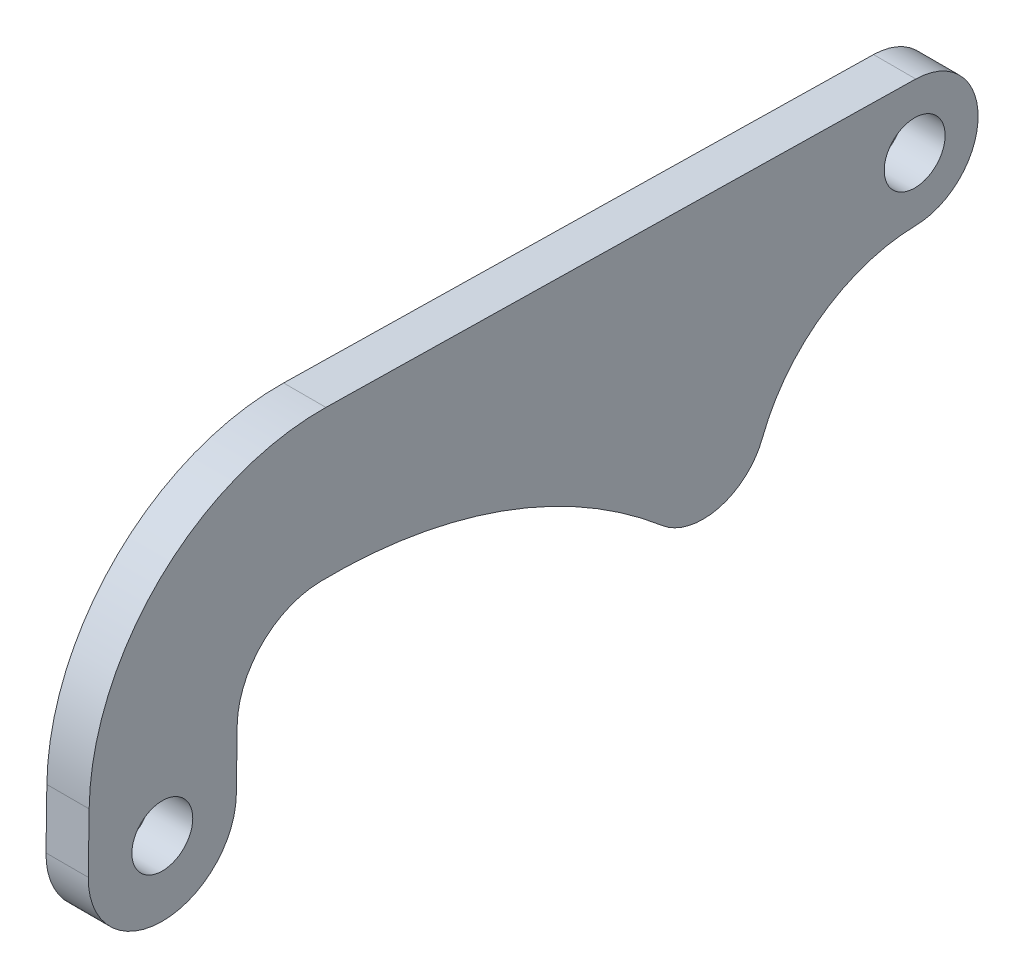
ISO-10303-21;
HEADER;
FILE_DESCRIPTION(('STEP AP214'),'2;1');
FILE_NAME('part.step','',(''),(''),'','','');
FILE_SCHEMA(('AUTOMOTIVE_DESIGN { 1 0 10303 214 1 1 1 1 }'));
ENDSEC;
DATA;
#1=APPLICATION_CONTEXT('core data for automotive mechanical design processes');
#2=APPLICATION_PROTOCOL_DEFINITION('international standard','automotive_design',2000,#1);
#3=PRODUCT_CONTEXT('',#1,'mechanical');
#4=PRODUCT('Part','Part','',(#3));
#5=PRODUCT_RELATED_PRODUCT_CATEGORY('part','',(#4));
#6=PRODUCT_DEFINITION_FORMATION('','',#4);
#7=PRODUCT_DEFINITION_CONTEXT('part definition',#1,'design');
#8=PRODUCT_DEFINITION('design','',#6,#7);
#9=PRODUCT_DEFINITION_SHAPE('','',#8);
#10=(LENGTH_UNIT() NAMED_UNIT(*) SI_UNIT(.MILLI.,.METRE.));
#11=(NAMED_UNIT(*) PLANE_ANGLE_UNIT() SI_UNIT($,.RADIAN.));
#12=(NAMED_UNIT(*) SI_UNIT($,.STERADIAN.) SOLID_ANGLE_UNIT());
#13=UNCERTAINTY_MEASURE_WITH_UNIT(LENGTH_MEASURE(1.E-05),#10,'distance_accuracy_value','');
#14=(GEOMETRIC_REPRESENTATION_CONTEXT(3) GLOBAL_UNCERTAINTY_ASSIGNED_CONTEXT((#13)) GLOBAL_UNIT_ASSIGNED_CONTEXT((#10,
#11,#12)) REPRESENTATION_CONTEXT('',''));
#15=CARTESIAN_POINT('',(0.,0.,0.));
#16=DIRECTION('',(0.,0.,1.));
#17=DIRECTION('',(1.,0.,0.));
#18=AXIS2_PLACEMENT_3D('',#15,#16,#17);
#19=CARTESIAN_POINT('',(1.5875,16.1580786363282,-56.4713237053307));
#20=DIRECTION('',(1.,0.,0.));
#21=DIRECTION('',(0.,0.,-1.));
#22=AXIS2_PLACEMENT_3D('',#19,#20,#21);
#23=PLANE('',#22);
#24=CARTESIAN_POINT('',(1.5875,0.,0.));
#25=DIRECTION('',(1.,0.,0.));
#26=DIRECTION('',(0.,0.,-1.));
#27=AXIS2_PLACEMENT_3D('',#24,#25,#26);
#28=CIRCLE('',#27,2.286);
#29=CARTESIAN_POINT('',(1.5875,0.,-2.286));
#30=VERTEX_POINT('',#29);
#31=EDGE_CURVE('E186',#30,#30,#28,.T.);
#32=ORIENTED_EDGE('',*,*,#31,.F.);
#33=EDGE_LOOP('',(#32));
#34=FACE_BOUND('',#33,.T.);
#35=CARTESIAN_POINT('',(1.5875,16.1580786363282,-56.4713237053307));
#36=DIRECTION('',(1.,0.,0.));
#37=DIRECTION('',(0.,0.,-1.));
#38=AXIS2_PLACEMENT_3D('',#35,#36,#37);
#39=CIRCLE('',#38,4.76249999999997);
#40=CARTESIAN_POINT('',(1.5875,11.3963361981293,-56.5562660519865));
#41=VERTEX_POINT('',#40);
#42=CARTESIAN_POINT('',(1.5875,20.9198210745271,-56.5562660519865));
#43=VERTEX_POINT('',#42);
#44=EDGE_CURVE('E209',#41,#43,#39,.T.);
#45=ORIENTED_EDGE('',*,*,#44,.T.);
#46=DIRECTION('',(0.,0.0178356633397855,0.999840931905286));
#47=VECTOR('',#46,1.);
#48=CARTESIAN_POINT('',(1.5875,20.9198210745271,-56.5562660519865));
#49=LINE('',#48,#47);
#50=CARTESIAN_POINT('',(1.5875,21.7096567039138,-12.2792477716243));
#51=VERTEX_POINT('',#50);
#52=EDGE_CURVE('E126',#43,#51,#49,.T.);
#53=ORIENTED_EDGE('',*,*,#52,.T.);
#54=CARTESIAN_POINT('',(1.5875,4.24993443051777,-11.9677925005533));
#55=DIRECTION('',(1.,0.,0.));
#56=DIRECTION('',(0.,0.,1.));
#57=AXIS2_PLACEMENT_3D('',#54,#55,#56);
#58=CIRCLE('',#57,17.4625);
#59=CARTESIAN_POINT('',(1.5875,4.49784969156588,5.49294758322719));
#60=VERTEX_POINT('',#59);
#61=EDGE_CURVE('E237',#51,#60,#58,.T.);
#62=ORIENTED_EDGE('',*,*,#61,.T.);
#63=DIRECTION('',(0.,-0.999899217396164,0.0141970085066924));
#64=VECTOR('',#63,1.);
#65=CARTESIAN_POINT('',(1.5875,0.078882128515306,5.55569002665744));
#66=LINE('',#65,#64);
#67=CARTESIAN_POINT('',(1.5875,0.078882128515306,5.55569002665744));
#68=VERTEX_POINT('',#67);
#69=EDGE_CURVE('E257',#60,#68,#66,.T.);
#70=ORIENTED_EDGE('',*,*,#69,.T.);
#71=CARTESIAN_POINT('',(1.5875,0.,0.));
#72=DIRECTION('',(1.,0.,0.));
#73=DIRECTION('',(0.,0.,-1.));
#74=AXIS2_PLACEMENT_3D('',#71,#72,#73);
#75=CIRCLE('',#74,5.55625);
#76=CARTESIAN_POINT('',(1.5875,-0.0788821285153071,-5.55569002665744));
#77=VERTEX_POINT('',#76);
#78=EDGE_CURVE('E253',#68,#77,#75,.T.);
#79=ORIENTED_EDGE('',*,*,#78,.T.);
#80=DIRECTION('',(0.,0.999899217396164,-0.0141970085066914));
#81=VECTOR('',#80,1.);
#82=CARTESIAN_POINT('',(1.5875,-0.0788821285153061,-5.55569002665744));
#83=LINE('',#82,#81);
#84=CARTESIAN_POINT('',(1.5875,4.34008543453526,-5.61843247008768));
#85=VERTEX_POINT('',#84);
#86=EDGE_CURVE('E256',#77,#85,#83,.T.);
#87=ORIENTED_EDGE('',*,*,#86,.T.);
#88=CARTESIAN_POINT('',(1.5875,4.24993443051777,-11.9677925005533));
#89=DIRECTION('',(-1.,0.,0.));
#90=DIRECTION('',(0.,0.,-1.));
#91=AXIS2_PLACEMENT_3D('',#88,#89,#90);
#92=CIRCLE('',#91,6.35);
#93=CARTESIAN_POINT('',(1.5875,10.5989243481163,-11.8545360383457));
#94=VERTEX_POINT('',#93);
#95=EDGE_CURVE('E157',#85,#94,#92,.T.);
#96=ORIENTED_EDGE('',*,*,#95,.T.);
#97=CARTESIAN_POINT('',(1.5875,-27.9191487336336,-12.5416407187613));
#98=DIRECTION('',(-1.,0.,0.));
#99=DIRECTION('',(0.,0.,1.));
#100=AXIS2_PLACEMENT_3D('',#97,#98,#99);
#101=CIRCLE('',#100,38.5242010530118);
#102=CARTESIAN_POINT('',(1.5875,1.41872534697317,-37.5096845188539));
#103=VERTEX_POINT('',#102);
#104=EDGE_CURVE('E151',#94,#103,#101,.T.);
#105=ORIENTED_EDGE('',*,*,#104,.T.);
#106=CARTESIAN_POINT('',(1.5875,5.04557863632817,-40.5963237053308));
#107=DIRECTION('',(1.,0.,0.));
#108=DIRECTION('',(0.,0.,-1.));
#109=AXIS2_PLACEMENT_3D('',#106,#107,#108);
#110=CIRCLE('',#109,4.7625);
#111=CARTESIAN_POINT('',(1.5875,3.33590888545608,-45.0413698910248));
#112=VERTEX_POINT('',#111);
#113=EDGE_CURVE('E155',#103,#112,#110,.T.);
#114=ORIENTED_EDGE('',*,*,#113,.T.);
#115=CARTESIAN_POINT('',(1.5875,-1.17927478392445,-56.7805960995076));
#116=DIRECTION('',(-1.,0.,0.));
#117=DIRECTION('',(0.,0.,1.));
#118=AXIS2_PLACEMENT_3D('',#115,#116,#117);
#119=CIRCLE('',#118,12.5776116787795);
#120=EDGE_CURVE('E66',#112,#41,#119,.T.);
#121=ORIENTED_EDGE('',*,*,#120,.T.);
#122=EDGE_LOOP('',(#45,#53,#62,#70,#79,#87,#96,#105,#114,#121));
#123=FACE_BOUND('',#122,.T.);
#124=CARTESIAN_POINT('',(1.5875,16.1580786363282,-56.4713237053307));
#125=DIRECTION('',(1.,0.,0.));
#126=DIRECTION('',(0.,0.,-1.));
#127=AXIS2_PLACEMENT_3D('',#124,#125,#126);
#128=CIRCLE('',#127,2.28599999999999);
#129=CARTESIAN_POINT('',(1.5875,16.1580786363282,-58.7573237053307));
#130=VERTEX_POINT('',#129);
#131=EDGE_CURVE('E275',#130,#130,#128,.T.);
#132=ORIENTED_EDGE('',*,*,#131,.F.);
#133=EDGE_LOOP('',(#132));
#134=FACE_BOUND('',#133,.T.);
#135=ADVANCED_FACE('F45',(#34,#123,#134),#23,.T.);
#136=CARTESIAN_POINT('',(-1.5875,16.1580786363282,-56.4713237053307));
#137=DIRECTION('',(1.,0.,0.));
#138=DIRECTION('',(0.,0.,-1.));
#139=AXIS2_PLACEMENT_3D('',#136,#137,#138);
#140=PLANE('',#139);
#141=CARTESIAN_POINT('',(-1.5875,16.1580786363282,-56.4713237053307));
#142=DIRECTION('',(1.,0.,0.));
#143=DIRECTION('',(0.,0.,-1.));
#144=AXIS2_PLACEMENT_3D('',#141,#142,#143);
#145=CIRCLE('',#144,4.76249999999997);
#146=CARTESIAN_POINT('',(-1.5875,11.3963361981293,-56.5562660519865));
#147=VERTEX_POINT('',#146);
#148=CARTESIAN_POINT('',(-1.5875,20.9198210745271,-56.5562660519865));
#149=VERTEX_POINT('',#148);
#150=EDGE_CURVE('E181',#147,#149,#145,.T.);
#151=ORIENTED_EDGE('',*,*,#150,.F.);
#152=CARTESIAN_POINT('',(-1.5875,-1.17927478392445,-56.7805960995076));
#153=DIRECTION('',(-1.,0.,0.));
#154=DIRECTION('',(0.,0.,1.));
#155=AXIS2_PLACEMENT_3D('',#152,#153,#154);
#156=CIRCLE('',#155,12.5776116787795);
#157=CARTESIAN_POINT('',(-1.5875,3.33590888545608,-45.0413698910248));
#158=VERTEX_POINT('',#157);
#159=EDGE_CURVE('E116',#158,#147,#156,.T.);
#160=ORIENTED_EDGE('',*,*,#159,.F.);
#161=CARTESIAN_POINT('',(-1.5875,5.04557863632817,-40.5963237053308));
#162=DIRECTION('',(1.,0.,0.));
#163=DIRECTION('',(0.,0.,-1.));
#164=AXIS2_PLACEMENT_3D('',#161,#162,#163);
#165=CIRCLE('',#164,4.7625);
#166=CARTESIAN_POINT('',(-1.5875,1.41872534697317,-37.5096845188539));
#167=VERTEX_POINT('',#166);
#168=EDGE_CURVE('E110',#167,#158,#165,.T.);
#169=ORIENTED_EDGE('',*,*,#168,.F.);
#170=CARTESIAN_POINT('',(-1.5875,-27.9191487336336,-12.5416407187613));
#171=DIRECTION('',(-1.,0.,0.));
#172=DIRECTION('',(0.,0.,1.));
#173=AXIS2_PLACEMENT_3D('',#170,#171,#172);
#174=CIRCLE('',#173,38.5242010530118);
#175=CARTESIAN_POINT('',(-1.5875,10.5989243481163,-11.8545360383457));
#176=VERTEX_POINT('',#175);
#177=EDGE_CURVE('E166',#176,#167,#174,.T.);
#178=ORIENTED_EDGE('',*,*,#177,.F.);
#179=CARTESIAN_POINT('',(-1.5875,4.24993443051777,-11.9677925005533));
#180=DIRECTION('',(-1.,0.,0.));
#181=DIRECTION('',(0.,0.,-1.));
#182=AXIS2_PLACEMENT_3D('',#179,#180,#181);
#183=CIRCLE('',#182,6.35);
#184=CARTESIAN_POINT('',(-1.5875,4.34008543453526,-5.61843247008768));
#185=VERTEX_POINT('',#184);
#186=EDGE_CURVE('E201',#185,#176,#183,.T.);
#187=ORIENTED_EDGE('',*,*,#186,.F.);
#188=DIRECTION('',(0.,0.999899217396164,-0.0141970085066914));
#189=VECTOR('',#188,1.);
#190=CARTESIAN_POINT('',(-1.5875,-0.0788821285153061,-5.55569002665744));
#191=LINE('',#190,#189);
#192=CARTESIAN_POINT('',(-1.5875,-0.0788821285153071,-5.55569002665744));
#193=VERTEX_POINT('',#192);
#194=EDGE_CURVE('E198',#193,#185,#191,.T.);
#195=ORIENTED_EDGE('',*,*,#194,.F.);
#196=CARTESIAN_POINT('',(-1.5875,0.,0.));
#197=DIRECTION('',(1.,0.,0.));
#198=DIRECTION('',(0.,0.,-1.));
#199=AXIS2_PLACEMENT_3D('',#196,#197,#198);
#200=CIRCLE('',#199,5.55625);
#201=CARTESIAN_POINT('',(-1.5875,0.078882128515306,5.55569002665744));
#202=VERTEX_POINT('',#201);
#203=EDGE_CURVE('E195',#202,#193,#200,.T.);
#204=ORIENTED_EDGE('',*,*,#203,.F.);
#205=DIRECTION('',(0.,-0.999899217396164,0.0141970085066924));
#206=VECTOR('',#205,1.);
#207=CARTESIAN_POINT('',(-1.5875,0.078882128515306,5.55569002665744));
#208=LINE('',#207,#206);
#209=CARTESIAN_POINT('',(-1.5875,4.49784969156588,5.49294758322719));
#210=VERTEX_POINT('',#209);
#211=EDGE_CURVE('E192',#210,#202,#208,.T.);
#212=ORIENTED_EDGE('',*,*,#211,.F.);
#213=CARTESIAN_POINT('',(-1.5875,4.24993443051777,-11.9677925005533));
#214=DIRECTION('',(1.,0.,0.));
#215=DIRECTION('',(0.,0.,1.));
#216=AXIS2_PLACEMENT_3D('',#213,#214,#215);
#217=CIRCLE('',#216,17.4625);
#218=CARTESIAN_POINT('',(-1.5875,21.7096567039138,-12.2792477716243));
#219=VERTEX_POINT('',#218);
#220=EDGE_CURVE('E189',#219,#210,#217,.T.);
#221=ORIENTED_EDGE('',*,*,#220,.F.);
#222=DIRECTION('',(0.,0.0178356633397855,0.999840931905286));
#223=VECTOR('',#222,1.);
#224=CARTESIAN_POINT('',(-1.5875,20.9198210745271,-56.5562660519865));
#225=LINE('',#224,#223);
#226=EDGE_CURVE('E185',#149,#219,#225,.T.);
#227=ORIENTED_EDGE('',*,*,#226,.F.);
#228=EDGE_LOOP('',(#151,#160,#169,#178,#187,#195,#204,#212,#221,#227));
#229=FACE_BOUND('',#228,.T.);
#230=CARTESIAN_POINT('',(-1.5875,0.,0.));
#231=DIRECTION('',(1.,0.,0.));
#232=DIRECTION('',(0.,0.,-1.));
#233=AXIS2_PLACEMENT_3D('',#230,#231,#232);
#234=CIRCLE('',#233,2.286);
#235=CARTESIAN_POINT('',(-1.5875,0.,-2.286));
#236=VERTEX_POINT('',#235);
#237=EDGE_CURVE('E272',#236,#236,#234,.T.);
#238=ORIENTED_EDGE('',*,*,#237,.T.);
#239=EDGE_LOOP('',(#238));
#240=FACE_BOUND('',#239,.T.);
#241=CARTESIAN_POINT('',(-1.5875,16.1580786363282,-56.4713237053307));
#242=DIRECTION('',(1.,0.,0.));
#243=DIRECTION('',(0.,0.,-1.));
#244=AXIS2_PLACEMENT_3D('',#241,#242,#243);
#245=CIRCLE('',#244,2.28599999999999);
#246=CARTESIAN_POINT('',(-1.5875,16.1580786363282,-58.7573237053307));
#247=VERTEX_POINT('',#246);
#248=EDGE_CURVE('E279',#247,#247,#245,.T.);
#249=ORIENTED_EDGE('',*,*,#248,.T.);
#250=EDGE_LOOP('',(#249));
#251=FACE_BOUND('',#250,.T.);
#252=ADVANCED_FACE('F241',(#229,#240,#251),#140,.F.);
#253=CARTESIAN_POINT('',(1.5875,16.1580786363282,-56.4713237053307));
#254=DIRECTION('',(-1.,0.,0.));
#255=DIRECTION('',(0.,0.,1.));
#256=AXIS2_PLACEMENT_3D('',#253,#254,#255);
#257=CYLINDRICAL_SURFACE('',#256,4.76249999999997);
#258=ORIENTED_EDGE('',*,*,#150,.T.);
#259=DIRECTION('',(-1.,0.,0.));
#260=VECTOR('',#259,1.);
#261=CARTESIAN_POINT('',(1.5875,20.9198210745271,-56.5562660519865));
#262=LINE('',#261,#260);
#263=EDGE_CURVE('E11',#43,#149,#262,.T.);
#264=ORIENTED_EDGE('',*,*,#263,.F.);
#265=ORIENTED_EDGE('',*,*,#44,.F.);
#266=DIRECTION('',(-1.,0.,0.));
#267=VECTOR('',#266,1.);
#268=CARTESIAN_POINT('',(1.5875,11.3963361981293,-56.5562660519865));
#269=LINE('',#268,#267);
#270=EDGE_CURVE('E177',#41,#147,#269,.T.);
#271=ORIENTED_EDGE('',*,*,#270,.T.);
#272=EDGE_LOOP('',(#258,#264,#265,#271));
#273=FACE_BOUND('',#272,.T.);
#274=ADVANCED_FACE('F47',(#273),#257,.T.);
#275=CARTESIAN_POINT('',(1.5875,20.9198210745271,-56.5562660519865));
#276=DIRECTION('',(0.,-0.999840931905285,0.0178356633397855));
#277=DIRECTION('',(0.,-0.0178356633397855,-0.999840931905286));
#278=AXIS2_PLACEMENT_3D('',#275,#276,#277);
#279=PLANE('',#278);
#280=ORIENTED_EDGE('',*,*,#226,.T.);
#281=DIRECTION('',(-1.,0.,0.));
#282=VECTOR('',#281,1.);
#283=CARTESIAN_POINT('',(1.5875,21.7096567039138,-12.2792477716243));
#284=LINE('',#283,#282);
#285=EDGE_CURVE('E55',#51,#219,#284,.T.);
#286=ORIENTED_EDGE('',*,*,#285,.F.);
#287=ORIENTED_EDGE('',*,*,#52,.F.);
#288=ORIENTED_EDGE('',*,*,#263,.T.);
#289=EDGE_LOOP('',(#280,#286,#287,#288));
#290=FACE_BOUND('',#289,.T.);
#291=ADVANCED_FACE('F320',(#290),#279,.F.);
#292=CARTESIAN_POINT('',(1.5875,4.24993443051777,-11.9677925005533));
#293=DIRECTION('',(-1.,0.,0.));
#294=DIRECTION('',(0.,0.,1.));
#295=AXIS2_PLACEMENT_3D('',#292,#293,#294);
#296=CYLINDRICAL_SURFACE('',#295,17.4625);
#297=ORIENTED_EDGE('',*,*,#220,.T.);
#298=DIRECTION('',(-1.,0.,0.));
#299=VECTOR('',#298,1.);
#300=CARTESIAN_POINT('',(1.5875,4.49784969156588,5.49294758322719));
#301=LINE('',#300,#299);
#302=EDGE_CURVE('E227',#60,#210,#301,.T.);
#303=ORIENTED_EDGE('',*,*,#302,.F.);
#304=ORIENTED_EDGE('',*,*,#61,.F.);
#305=ORIENTED_EDGE('',*,*,#285,.T.);
#306=EDGE_LOOP('',(#297,#303,#304,#305));
#307=FACE_BOUND('',#306,.T.);
#308=ADVANCED_FACE('F235',(#307),#296,.T.);
#309=CARTESIAN_POINT('',(1.5875,0.078882128515306,5.55569002665744));
#310=DIRECTION('',(0.,-0.0141970085066924,-0.999899217396164));
#311=DIRECTION('',(0.,0.999899217396164,-0.0141970085066924));
#312=AXIS2_PLACEMENT_3D('',#309,#310,#311);
#313=PLANE('',#312);
#314=ORIENTED_EDGE('',*,*,#211,.T.);
#315=DIRECTION('',(-1.,0.,0.));
#316=VECTOR('',#315,1.);
#317=CARTESIAN_POINT('',(1.5875,0.078882128515306,5.55569002665744));
#318=LINE('',#317,#316);
#319=EDGE_CURVE('E223',#68,#202,#318,.T.);
#320=ORIENTED_EDGE('',*,*,#319,.F.);
#321=ORIENTED_EDGE('',*,*,#69,.F.);
#322=ORIENTED_EDGE('',*,*,#302,.T.);
#323=EDGE_LOOP('',(#314,#320,#321,#322));
#324=FACE_BOUND('',#323,.T.);
#325=ADVANCED_FACE('F247',(#324),#313,.F.);
#326=CARTESIAN_POINT('',(1.5875,0.,0.));
#327=DIRECTION('',(-1.,0.,0.));
#328=DIRECTION('',(0.,0.,1.));
#329=AXIS2_PLACEMENT_3D('',#326,#327,#328);
#330=CYLINDRICAL_SURFACE('',#329,5.55625);
#331=ORIENTED_EDGE('',*,*,#203,.T.);
#332=DIRECTION('',(-1.,0.,0.));
#333=VECTOR('',#332,1.);
#334=CARTESIAN_POINT('',(1.5875,-0.0788821285153071,-5.55569002665744));
#335=LINE('',#334,#333);
#336=EDGE_CURVE('E219',#77,#193,#335,.T.);
#337=ORIENTED_EDGE('',*,*,#336,.F.);
#338=ORIENTED_EDGE('',*,*,#78,.F.);
#339=ORIENTED_EDGE('',*,*,#319,.T.);
#340=EDGE_LOOP('',(#331,#337,#338,#339));
#341=FACE_BOUND('',#340,.T.);
#342=ADVANCED_FACE('F251',(#341),#330,.T.);
#343=CARTESIAN_POINT('',(1.5875,-0.0788821285153061,-5.55569002665744));
#344=DIRECTION('',(0.,0.0141970085066914,0.999899217396164));
#345=DIRECTION('',(0.,-0.999899217396164,0.0141970085066914));
#346=AXIS2_PLACEMENT_3D('',#343,#344,#345);
#347=PLANE('',#346);
#348=ORIENTED_EDGE('',*,*,#194,.T.);
#349=DIRECTION('',(-1.,0.,0.));
#350=VECTOR('',#349,1.);
#351=CARTESIAN_POINT('',(1.5875,4.34008543453526,-5.61843247008768));
#352=LINE('',#351,#350);
#353=EDGE_CURVE('E215',#85,#185,#352,.T.);
#354=ORIENTED_EDGE('',*,*,#353,.F.);
#355=ORIENTED_EDGE('',*,*,#86,.F.);
#356=ORIENTED_EDGE('',*,*,#336,.T.);
#357=EDGE_LOOP('',(#348,#354,#355,#356));
#358=FACE_BOUND('',#357,.T.);
#359=ADVANCED_FACE('F310',(#358),#347,.F.);
#360=CARTESIAN_POINT('',(1.5875,4.24993443051777,-11.9677925005533));
#361=DIRECTION('',(-1.,0.,0.));
#362=DIRECTION('',(0.,0.,1.));
#363=AXIS2_PLACEMENT_3D('',#360,#361,#362);
#364=CYLINDRICAL_SURFACE('',#363,6.35);
#365=ORIENTED_EDGE('',*,*,#186,.T.);
#366=DIRECTION('',(-1.,0.,0.));
#367=VECTOR('',#366,1.);
#368=CARTESIAN_POINT('',(1.5875,10.5989243481163,-11.8545360383457));
#369=LINE('',#368,#367);
#370=EDGE_CURVE('E168',#94,#176,#369,.T.);
#371=ORIENTED_EDGE('',*,*,#370,.F.);
#372=ORIENTED_EDGE('',*,*,#95,.F.);
#373=ORIENTED_EDGE('',*,*,#353,.T.);
#374=EDGE_LOOP('',(#365,#371,#372,#373));
#375=FACE_BOUND('',#374,.T.);
#376=ADVANCED_FACE('F307',(#375),#364,.F.);
#377=CARTESIAN_POINT('',(1.5875,-27.9191487336336,-12.5416407187613));
#378=DIRECTION('',(-1.,0.,0.));
#379=DIRECTION('',(0.,0.,1.));
#380=AXIS2_PLACEMENT_3D('',#377,#378,#379);
#381=CYLINDRICAL_SURFACE('',#380,38.5242010530118);
#382=ORIENTED_EDGE('',*,*,#177,.T.);
#383=DIRECTION('',(-1.,0.,0.));
#384=VECTOR('',#383,1.);
#385=CARTESIAN_POINT('',(1.5875,1.41872534697317,-37.5096845188539));
#386=LINE('',#385,#384);
#387=EDGE_CURVE('E163',#103,#167,#386,.T.);
#388=ORIENTED_EDGE('',*,*,#387,.F.);
#389=ORIENTED_EDGE('',*,*,#104,.F.);
#390=ORIENTED_EDGE('',*,*,#370,.T.);
#391=EDGE_LOOP('',(#382,#388,#389,#390));
#392=FACE_BOUND('',#391,.T.);
#393=ADVANCED_FACE('F164',(#392),#381,.F.);
#394=CARTESIAN_POINT('',(1.5875,5.04557863632817,-40.5963237053308));
#395=DIRECTION('',(-1.,0.,0.));
#396=DIRECTION('',(0.,0.,1.));
#397=AXIS2_PLACEMENT_3D('',#394,#395,#396);
#398=CYLINDRICAL_SURFACE('',#397,4.7625);
#399=ORIENTED_EDGE('',*,*,#168,.T.);
#400=DIRECTION('',(-1.,0.,0.));
#401=VECTOR('',#400,1.);
#402=CARTESIAN_POINT('',(1.5875,3.33590888545608,-45.0413698910248));
#403=LINE('',#402,#401);
#404=EDGE_CURVE('E169',#112,#158,#403,.T.);
#405=ORIENTED_EDGE('',*,*,#404,.F.);
#406=ORIENTED_EDGE('',*,*,#113,.F.);
#407=ORIENTED_EDGE('',*,*,#387,.T.);
#408=EDGE_LOOP('',(#399,#405,#406,#407));
#409=FACE_BOUND('',#408,.T.);
#410=ADVANCED_FACE('F171',(#409),#398,.T.);
#411=CARTESIAN_POINT('',(1.5875,-1.17927478392445,-56.7805960995076));
#412=DIRECTION('',(-1.,0.,0.));
#413=DIRECTION('',(0.,0.,1.));
#414=AXIS2_PLACEMENT_3D('',#411,#412,#413);
#415=CYLINDRICAL_SURFACE('',#414,12.5776116787795);
#416=ORIENTED_EDGE('',*,*,#159,.T.);
#417=ORIENTED_EDGE('',*,*,#270,.F.);
#418=ORIENTED_EDGE('',*,*,#120,.F.);
#419=ORIENTED_EDGE('',*,*,#404,.T.);
#420=EDGE_LOOP('',(#416,#417,#418,#419));
#421=FACE_BOUND('',#420,.T.);
#422=ADVANCED_FACE('F300',(#421),#415,.F.);
#423=CARTESIAN_POINT('',(1.5875,0.,0.));
#424=DIRECTION('',(-1.,0.,0.));
#425=DIRECTION('',(0.,0.,1.));
#426=AXIS2_PLACEMENT_3D('',#423,#424,#425);
#427=CYLINDRICAL_SURFACE('',#426,2.286);
#428=ORIENTED_EDGE('',*,*,#31,.T.);
#429=EDGE_LOOP('',(#428));
#430=FACE_BOUND('',#429,.T.);
#431=ORIENTED_EDGE('',*,*,#237,.F.);
#432=EDGE_LOOP('',(#431));
#433=FACE_BOUND('',#432,.T.);
#434=ADVANCED_FACE('F297',(#430,#433),#427,.F.);
#435=CARTESIAN_POINT('',(1.5875,16.1580786363282,-56.4713237053307));
#436=DIRECTION('',(-1.,0.,0.));
#437=DIRECTION('',(0.,0.,1.));
#438=AXIS2_PLACEMENT_3D('',#435,#436,#437);
#439=CYLINDRICAL_SURFACE('',#438,2.28599999999999);
#440=ORIENTED_EDGE('',*,*,#131,.T.);
#441=EDGE_LOOP('',(#440));
#442=FACE_BOUND('',#441,.T.);
#443=ORIENTED_EDGE('',*,*,#248,.F.);
#444=EDGE_LOOP('',(#443));
#445=FACE_BOUND('',#444,.T.);
#446=ADVANCED_FACE('F287',(#442,#445),#439,.F.);
#447=CLOSED_SHELL('',(#135,#252,#274,#291,#308,#325,#342,#359,#376,#393,#410,#422,#434,#446));
#448=MANIFOLD_SOLID_BREP('B2',#447);
#449=ADVANCED_BREP_SHAPE_REPRESENTATION('',(#18,#448),#14);
#450=SHAPE_DEFINITION_REPRESENTATION(#9,#449);
ENDSEC;
END-ISO-10303-21;
